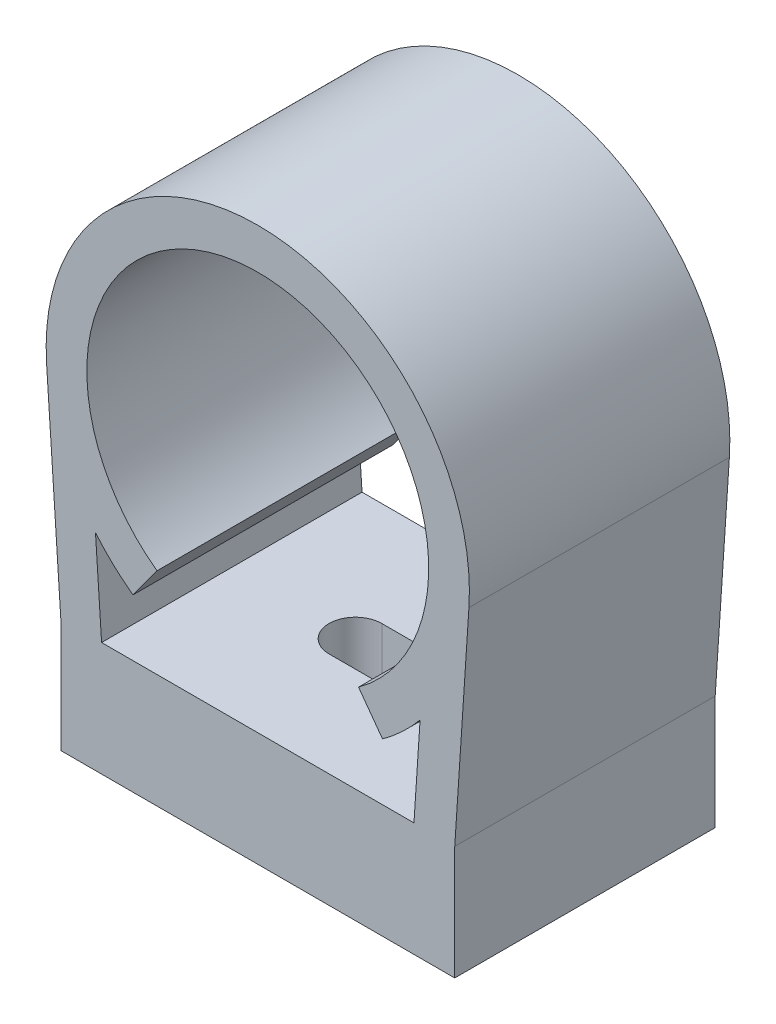
ISO-10303-21;
HEADER;
FILE_DESCRIPTION(('STEP AP214'),'2;1');
FILE_NAME('part.step','',(''),(''),'','','');
FILE_SCHEMA(('AUTOMOTIVE_DESIGN { 1 0 10303 214 1 1 1 1 }'));
ENDSEC;
DATA;
#1=APPLICATION_CONTEXT('core data for automotive mechanical design processes');
#2=APPLICATION_PROTOCOL_DEFINITION('international standard','automotive_design',2000,#1);
#3=PRODUCT_CONTEXT('',#1,'mechanical');
#4=PRODUCT('Part','Part','',(#3));
#5=PRODUCT_RELATED_PRODUCT_CATEGORY('part','',(#4));
#6=PRODUCT_DEFINITION_FORMATION('','',#4);
#7=PRODUCT_DEFINITION_CONTEXT('part definition',#1,'design');
#8=PRODUCT_DEFINITION('design','',#6,#7);
#9=PRODUCT_DEFINITION_SHAPE('','',#8);
#10=(LENGTH_UNIT() NAMED_UNIT(*) SI_UNIT(.MILLI.,.METRE.));
#11=(NAMED_UNIT(*) PLANE_ANGLE_UNIT() SI_UNIT($,.RADIAN.));
#12=(NAMED_UNIT(*) SI_UNIT($,.STERADIAN.) SOLID_ANGLE_UNIT());
#13=UNCERTAINTY_MEASURE_WITH_UNIT(LENGTH_MEASURE(1.E-05),#10,'distance_accuracy_value','');
#14=(GEOMETRIC_REPRESENTATION_CONTEXT(3) GLOBAL_UNCERTAINTY_ASSIGNED_CONTEXT((#13)) GLOBAL_UNIT_ASSIGNED_CONTEXT((#10,
#11,#12)) REPRESENTATION_CONTEXT('',''));
#15=CARTESIAN_POINT('',(0.,0.,0.));
#16=DIRECTION('',(0.,0.,1.));
#17=DIRECTION('',(1.,0.,0.));
#18=AXIS2_PLACEMENT_3D('',#15,#16,#17);
#19=CARTESIAN_POINT('',(15.367,26.67,20.32));
#20=DIRECTION('',(0.,0.,1.));
#21=DIRECTION('',(1.,0.,0.));
#22=AXIS2_PLACEMENT_3D('',#19,#20,#21);
#23=PLANE('',#22);
#24=DIRECTION('',(0.,-1.,0.));
#25=VECTOR('',#24,1.);
#26=CARTESIAN_POINT('',(0.,0.,20.32));
#27=LINE('',#26,#25);
#28=CARTESIAN_POINT('',(0.,8.89,20.32));
#29=VERTEX_POINT('',#28);
#30=CARTESIAN_POINT('',(0.,0.,20.32));
#31=VERTEX_POINT('',#30);
#32=EDGE_CURVE('E256',#29,#31,#27,.T.);
#33=ORIENTED_EDGE('',*,*,#32,.T.);
#34=DIRECTION('',(1.,0.,0.));
#35=VECTOR('',#34,1.);
#36=CARTESIAN_POINT('',(0.,0.,20.32));
#37=LINE('',#36,#35);
#38=CARTESIAN_POINT('',(30.734,0.,20.32));
#39=VERTEX_POINT('',#38);
#40=EDGE_CURVE('E259',#31,#39,#37,.T.);
#41=ORIENTED_EDGE('',*,*,#40,.T.);
#42=DIRECTION('',(0.,1.,0.));
#43=VECTOR('',#42,1.);
#44=CARTESIAN_POINT('',(30.734,0.,20.32));
#45=LINE('',#44,#43);
#46=CARTESIAN_POINT('',(30.734,8.89,20.32));
#47=VERTEX_POINT('',#46);
#48=EDGE_CURVE('E262',#39,#47,#45,.T.);
#49=ORIENTED_EDGE('',*,*,#48,.T.);
#50=DIRECTION('',(0.0661805168711333,0.997807666430094,0.));
#51=VECTOR('',#50,1.);
#52=CARTESIAN_POINT('',(30.734,8.89,20.32));
#53=LINE('',#52,#51);
#54=CARTESIAN_POINT('',(31.8408045727609,25.5773596664576,20.32));
#55=VERTEX_POINT('',#54);
#56=EDGE_CURVE('E264',#47,#55,#53,.T.);
#57=ORIENTED_EDGE('',*,*,#56,.T.);
#58=CARTESIAN_POINT('',(15.367,26.67,20.32));
#59=DIRECTION('',(0.,0.,1.));
#60=DIRECTION('',(1.,0.,0.));
#61=AXIS2_PLACEMENT_3D('',#58,#59,#60);
#62=CIRCLE('',#61,16.51);
#63=CARTESIAN_POINT('',(-1.10680457276085,25.5773596664576,20.32));
#64=VERTEX_POINT('',#63);
#65=EDGE_CURVE('E266',#55,#64,#62,.T.);
#66=ORIENTED_EDGE('',*,*,#65,.T.);
#67=DIRECTION('',(0.0661805168711327,-0.997807666430094,0.));
#68=VECTOR('',#67,1.);
#69=CARTESIAN_POINT('',(0.,8.89,20.32));
#70=LINE('',#69,#68);
#71=EDGE_CURVE('E268',#64,#29,#70,.T.);
#72=ORIENTED_EDGE('',*,*,#71,.T.);
#73=EDGE_LOOP('',(#33,#41,#49,#57,#66,#72));
#74=FACE_BOUND('',#73,.T.);
#75=DIRECTION('',(0.0661805168711333,-0.997807666430094,0.));
#76=VECTOR('',#75,1.);
#77=CARTESIAN_POINT('',(3.18197595269974,8.89,20.32));
#78=LINE('',#77,#76);
#79=CARTESIAN_POINT('',(2.70546011961717,16.0744581140238,20.32));
#80=VERTEX_POINT('',#79);
#81=CARTESIAN_POINT('',(3.18197595269974,8.89,20.32));
#82=VERTEX_POINT('',#81);
#83=EDGE_CURVE('E199',#80,#82,#78,.T.);
#84=ORIENTED_EDGE('',*,*,#83,.F.);
#85=CARTESIAN_POINT('',(15.367,26.67,20.32));
#86=DIRECTION('',(0.,0.,-1.));
#87=DIRECTION('',(1.,0.,0.));
#88=AXIS2_PLACEMENT_3D('',#85,#86,#87);
#89=CIRCLE('',#88,16.51);
#90=CARTESIAN_POINT('',(5.63263432986,13.335,20.32));
#91=VERTEX_POINT('',#90);
#92=EDGE_CURVE('E197',#91,#80,#89,.T.);
#93=ORIENTED_EDGE('',*,*,#92,.F.);
#94=DIRECTION('',(-0.589604219875227,-0.807692307692308,0.));
#95=VECTOR('',#94,1.);
#96=CARTESIAN_POINT('',(5.63263432986,13.335,20.32));
#97=LINE('',#96,#95);
#98=CARTESIAN_POINT('',(7.50462772796385,15.8994230769231,20.32));
#99=VERTEX_POINT('',#98);
#100=EDGE_CURVE('E213',#99,#91,#97,.T.);
#101=ORIENTED_EDGE('',*,*,#100,.F.);
#102=CARTESIAN_POINT('',(15.367,26.67,20.32));
#103=DIRECTION('',(0.,0.,1.));
#104=DIRECTION('',(1.,0.,0.));
#105=AXIS2_PLACEMENT_3D('',#102,#103,#104);
#106=CIRCLE('',#105,13.335);
#107=CARTESIAN_POINT('',(23.2293722720361,15.8994230769231,20.32));
#108=VERTEX_POINT('',#107);
#109=EDGE_CURVE('E210',#108,#99,#106,.T.);
#110=ORIENTED_EDGE('',*,*,#109,.F.);
#111=DIRECTION('',(-0.589604219875227,0.807692307692307,0.));
#112=VECTOR('',#111,1.);
#113=CARTESIAN_POINT('',(25.10136567014,13.335,20.32));
#114=LINE('',#113,#112);
#115=CARTESIAN_POINT('',(25.10136567014,13.335,20.32));
#116=VERTEX_POINT('',#115);
#117=EDGE_CURVE('E208',#116,#108,#114,.T.);
#118=ORIENTED_EDGE('',*,*,#117,.F.);
#119=CARTESIAN_POINT('',(15.367,26.67,20.32));
#120=DIRECTION('',(0.,0.,-1.));
#121=DIRECTION('',(1.,0.,0.));
#122=AXIS2_PLACEMENT_3D('',#119,#120,#121);
#123=CIRCLE('',#122,16.51);
#124=CARTESIAN_POINT('',(28.0285398803828,16.0744581140238,20.32));
#125=VERTEX_POINT('',#124);
#126=EDGE_CURVE('E206',#125,#116,#123,.T.);
#127=ORIENTED_EDGE('',*,*,#126,.F.);
#128=DIRECTION('',(0.066180516871133,0.997807666430094,0.));
#129=VECTOR('',#128,1.);
#130=CARTESIAN_POINT('',(27.5520240473003,8.89,20.32));
#131=LINE('',#130,#129);
#132=CARTESIAN_POINT('',(27.5520240473003,8.89,20.32));
#133=VERTEX_POINT('',#132);
#134=EDGE_CURVE('E204',#133,#125,#131,.T.);
#135=ORIENTED_EDGE('',*,*,#134,.F.);
#136=DIRECTION('',(1.,0.,0.));
#137=VECTOR('',#136,1.);
#138=CARTESIAN_POINT('',(3.18197595269974,8.89,20.32));
#139=LINE('',#138,#137);
#140=EDGE_CURVE('E202',#82,#133,#139,.T.);
#141=ORIENTED_EDGE('',*,*,#140,.F.);
#142=EDGE_LOOP('',(#84,#93,#101,#110,#118,#127,#135,#141));
#143=FACE_BOUND('',#142,.T.);
#144=ADVANCED_FACE('F35',(#74,#143),#23,.T.);
#145=CARTESIAN_POINT('',(15.367,26.67,0.));
#146=DIRECTION('',(0.,0.,1.));
#147=DIRECTION('',(1.,0.,0.));
#148=AXIS2_PLACEMENT_3D('',#145,#146,#147);
#149=PLANE('',#148);
#150=DIRECTION('',(0.,-1.,0.));
#151=VECTOR('',#150,1.);
#152=CARTESIAN_POINT('',(0.,0.,0.));
#153=LINE('',#152,#151);
#154=CARTESIAN_POINT('',(0.,8.89,0.));
#155=VERTEX_POINT('',#154);
#156=CARTESIAN_POINT('',(0.,0.,0.));
#157=VERTEX_POINT('',#156);
#158=EDGE_CURVE('E255',#155,#157,#153,.T.);
#159=ORIENTED_EDGE('',*,*,#158,.F.);
#160=DIRECTION('',(0.0661805168711327,-0.997807666430094,0.));
#161=VECTOR('',#160,1.);
#162=CARTESIAN_POINT('',(0.,8.89,0.));
#163=LINE('',#162,#161);
#164=CARTESIAN_POINT('',(-1.10680457276085,25.5773596664576,0.));
#165=VERTEX_POINT('',#164);
#166=EDGE_CURVE('E260',#165,#155,#163,.T.);
#167=ORIENTED_EDGE('',*,*,#166,.F.);
#168=CARTESIAN_POINT('',(15.367,26.67,0.));
#169=DIRECTION('',(0.,0.,1.));
#170=DIRECTION('',(1.,0.,0.));
#171=AXIS2_PLACEMENT_3D('',#168,#169,#170);
#172=CIRCLE('',#171,16.51);
#173=CARTESIAN_POINT('',(31.8408045727609,25.5773596664576,0.));
#174=VERTEX_POINT('',#173);
#175=EDGE_CURVE('E279',#174,#165,#172,.T.);
#176=ORIENTED_EDGE('',*,*,#175,.F.);
#177=DIRECTION('',(0.0661805168711333,0.997807666430094,0.));
#178=VECTOR('',#177,1.);
#179=CARTESIAN_POINT('',(30.734,8.89,0.));
#180=LINE('',#179,#178);
#181=CARTESIAN_POINT('',(30.734,8.89,0.));
#182=VERTEX_POINT('',#181);
#183=EDGE_CURVE('E277',#182,#174,#180,.T.);
#184=ORIENTED_EDGE('',*,*,#183,.F.);
#185=DIRECTION('',(0.,1.,0.));
#186=VECTOR('',#185,1.);
#187=CARTESIAN_POINT('',(30.734,0.,0.));
#188=LINE('',#187,#186);
#189=CARTESIAN_POINT('',(30.734,0.,0.));
#190=VERTEX_POINT('',#189);
#191=EDGE_CURVE('E275',#190,#182,#188,.T.);
#192=ORIENTED_EDGE('',*,*,#191,.F.);
#193=DIRECTION('',(1.,0.,0.));
#194=VECTOR('',#193,1.);
#195=CARTESIAN_POINT('',(0.,0.,0.));
#196=LINE('',#195,#194);
#197=EDGE_CURVE('E273',#157,#190,#196,.T.);
#198=ORIENTED_EDGE('',*,*,#197,.F.);
#199=EDGE_LOOP('',(#159,#167,#176,#184,#192,#198));
#200=FACE_BOUND('',#199,.T.);
#201=CARTESIAN_POINT('',(15.367,26.67,0.));
#202=DIRECTION('',(0.,0.,-1.));
#203=DIRECTION('',(1.,0.,0.));
#204=AXIS2_PLACEMENT_3D('',#201,#202,#203);
#205=CIRCLE('',#204,16.51);
#206=CARTESIAN_POINT('',(5.63263432986,13.335,0.));
#207=VERTEX_POINT('',#206);
#208=CARTESIAN_POINT('',(2.70546011961717,16.0744581140238,0.));
#209=VERTEX_POINT('',#208);
#210=EDGE_CURVE('E177',#207,#209,#205,.T.);
#211=ORIENTED_EDGE('',*,*,#210,.T.);
#212=DIRECTION('',(0.0661805168711333,-0.997807666430094,0.));
#213=VECTOR('',#212,1.);
#214=CARTESIAN_POINT('',(3.18197595269974,8.89,0.));
#215=LINE('',#214,#213);
#216=CARTESIAN_POINT('',(3.18197595269974,8.89,0.));
#217=VERTEX_POINT('',#216);
#218=EDGE_CURVE('E218',#209,#217,#215,.T.);
#219=ORIENTED_EDGE('',*,*,#218,.T.);
#220=DIRECTION('',(1.,0.,0.));
#221=VECTOR('',#220,1.);
#222=CARTESIAN_POINT('',(3.18197595269974,8.89,0.));
#223=LINE('',#222,#221);
#224=CARTESIAN_POINT('',(27.5520240473003,8.89,0.));
#225=VERTEX_POINT('',#224);
#226=EDGE_CURVE('E221',#217,#225,#223,.T.);
#227=ORIENTED_EDGE('',*,*,#226,.T.);
#228=DIRECTION('',(0.066180516871133,0.997807666430094,0.));
#229=VECTOR('',#228,1.);
#230=CARTESIAN_POINT('',(27.5520240473003,8.89,0.));
#231=LINE('',#230,#229);
#232=CARTESIAN_POINT('',(28.0285398803828,16.0744581140238,0.));
#233=VERTEX_POINT('',#232);
#234=EDGE_CURVE('E224',#225,#233,#231,.T.);
#235=ORIENTED_EDGE('',*,*,#234,.T.);
#236=CARTESIAN_POINT('',(15.367,26.67,0.));
#237=DIRECTION('',(0.,0.,-1.));
#238=DIRECTION('',(1.,0.,0.));
#239=AXIS2_PLACEMENT_3D('',#236,#237,#238);
#240=CIRCLE('',#239,16.51);
#241=CARTESIAN_POINT('',(25.10136567014,13.335,0.));
#242=VERTEX_POINT('',#241);
#243=EDGE_CURVE('E227',#233,#242,#240,.T.);
#244=ORIENTED_EDGE('',*,*,#243,.T.);
#245=DIRECTION('',(-0.589604219875227,0.807692307692307,0.));
#246=VECTOR('',#245,1.);
#247=CARTESIAN_POINT('',(25.10136567014,13.335,0.));
#248=LINE('',#247,#246);
#249=CARTESIAN_POINT('',(23.2293722720361,15.8994230769231,0.));
#250=VERTEX_POINT('',#249);
#251=EDGE_CURVE('E230',#242,#250,#248,.T.);
#252=ORIENTED_EDGE('',*,*,#251,.T.);
#253=CARTESIAN_POINT('',(15.367,26.67,0.));
#254=DIRECTION('',(0.,0.,1.));
#255=DIRECTION('',(1.,0.,0.));
#256=AXIS2_PLACEMENT_3D('',#253,#254,#255);
#257=CIRCLE('',#256,13.335);
#258=CARTESIAN_POINT('',(7.50462772796384,15.8994230769231,0.));
#259=VERTEX_POINT('',#258);
#260=EDGE_CURVE('E233',#250,#259,#257,.T.);
#261=ORIENTED_EDGE('',*,*,#260,.T.);
#262=DIRECTION('',(-0.589604219875227,-0.807692307692308,0.));
#263=VECTOR('',#262,1.);
#264=CARTESIAN_POINT('',(5.63263432986,13.335,0.));
#265=LINE('',#264,#263);
#266=EDGE_CURVE('E200',#259,#207,#265,.T.);
#267=ORIENTED_EDGE('',*,*,#266,.T.);
#268=EDGE_LOOP('',(#211,#219,#227,#235,#244,#252,#261,#267));
#269=FACE_BOUND('',#268,.T.);
#270=ADVANCED_FACE('F302',(#200,#269),#149,.F.);
#271=CARTESIAN_POINT('',(0.,0.,20.32));
#272=DIRECTION('',(1.,0.,0.));
#273=DIRECTION('',(0.,0.,-1.));
#274=AXIS2_PLACEMENT_3D('',#271,#272,#273);
#275=PLANE('',#274);
#276=ORIENTED_EDGE('',*,*,#158,.T.);
#277=DIRECTION('',(0.,0.,-1.));
#278=VECTOR('',#277,1.);
#279=CARTESIAN_POINT('',(0.,0.,20.32));
#280=LINE('',#279,#278);
#281=EDGE_CURVE('E11',#31,#157,#280,.T.);
#282=ORIENTED_EDGE('',*,*,#281,.F.);
#283=ORIENTED_EDGE('',*,*,#32,.F.);
#284=DIRECTION('',(0.,0.,-1.));
#285=VECTOR('',#284,1.);
#286=CARTESIAN_POINT('',(0.,8.89,20.32));
#287=LINE('',#286,#285);
#288=EDGE_CURVE('E270',#29,#155,#287,.T.);
#289=ORIENTED_EDGE('',*,*,#288,.T.);
#290=EDGE_LOOP('',(#276,#282,#283,#289));
#291=FACE_BOUND('',#290,.T.);
#292=ADVANCED_FACE('F37',(#291),#275,.F.);
#293=CARTESIAN_POINT('',(0.,0.,20.32));
#294=DIRECTION('',(0.,1.,0.));
#295=DIRECTION('',(0.,0.,1.));
#296=AXIS2_PLACEMENT_3D('',#293,#294,#295);
#297=PLANE('',#296);
#298=DIRECTION('',(1.,0.,0.));
#299=VECTOR('',#298,1.);
#300=CARTESIAN_POINT('',(12.827,0.,8.1026));
#301=LINE('',#300,#299);
#302=CARTESIAN_POINT('',(12.827,0.,8.1026));
#303=VERTEX_POINT('',#302);
#304=CARTESIAN_POINT('',(17.907,0.,8.1026));
#305=VERTEX_POINT('',#304);
#306=EDGE_CURVE('E183',#303,#305,#301,.T.);
#307=ORIENTED_EDGE('',*,*,#306,.F.);
#308=CARTESIAN_POINT('',(12.827,0.,10.16));
#309=DIRECTION('',(0.,-1.,0.));
#310=DIRECTION('',(0.,0.,-1.));
#311=AXIS2_PLACEMENT_3D('',#308,#309,#310);
#312=CIRCLE('',#311,2.0574);
#313=CARTESIAN_POINT('',(12.827,0.,12.2174));
#314=VERTEX_POINT('',#313);
#315=EDGE_CURVE('E50',#314,#303,#312,.T.);
#316=ORIENTED_EDGE('',*,*,#315,.F.);
#317=DIRECTION('',(-1.,0.,0.));
#318=VECTOR('',#317,1.);
#319=CARTESIAN_POINT('',(12.827,0.,12.2174));
#320=LINE('',#319,#318);
#321=CARTESIAN_POINT('',(17.907,0.,12.2174));
#322=VERTEX_POINT('',#321);
#323=EDGE_CURVE('E170',#322,#314,#320,.T.);
#324=ORIENTED_EDGE('',*,*,#323,.F.);
#325=CARTESIAN_POINT('',(17.907,0.,10.16));
#326=DIRECTION('',(0.,-1.,0.));
#327=DIRECTION('',(0.,0.,-1.));
#328=AXIS2_PLACEMENT_3D('',#325,#326,#327);
#329=CIRCLE('',#328,2.0574);
#330=EDGE_CURVE('E178',#305,#322,#329,.T.);
#331=ORIENTED_EDGE('',*,*,#330,.F.);
#332=EDGE_LOOP('',(#307,#316,#324,#331));
#333=FACE_BOUND('',#332,.T.);
#334=ORIENTED_EDGE('',*,*,#197,.T.);
#335=DIRECTION('',(0.,0.,-1.));
#336=VECTOR('',#335,1.);
#337=CARTESIAN_POINT('',(30.734,0.,20.32));
#338=LINE('',#337,#336);
#339=EDGE_CURVE('E43',#39,#190,#338,.T.);
#340=ORIENTED_EDGE('',*,*,#339,.F.);
#341=ORIENTED_EDGE('',*,*,#40,.F.);
#342=ORIENTED_EDGE('',*,*,#281,.T.);
#343=EDGE_LOOP('',(#334,#340,#341,#342));
#344=FACE_BOUND('',#343,.T.);
#345=ADVANCED_FACE('F181',(#333,#344),#297,.F.);
#346=CARTESIAN_POINT('',(30.734,0.,20.32));
#347=DIRECTION('',(-1.,0.,0.));
#348=DIRECTION('',(0.,0.,1.));
#349=AXIS2_PLACEMENT_3D('',#346,#347,#348);
#350=PLANE('',#349);
#351=ORIENTED_EDGE('',*,*,#191,.T.);
#352=DIRECTION('',(0.,0.,-1.));
#353=VECTOR('',#352,1.);
#354=CARTESIAN_POINT('',(30.734,8.89,20.32));
#355=LINE('',#354,#353);
#356=EDGE_CURVE('E290',#47,#182,#355,.T.);
#357=ORIENTED_EDGE('',*,*,#356,.F.);
#358=ORIENTED_EDGE('',*,*,#48,.F.);
#359=ORIENTED_EDGE('',*,*,#339,.T.);
#360=EDGE_LOOP('',(#351,#357,#358,#359));
#361=FACE_BOUND('',#360,.T.);
#362=ADVANCED_FACE('F297',(#361),#350,.F.);
#363=CARTESIAN_POINT('',(30.734,8.89,20.32));
#364=DIRECTION('',(-0.997807666430094,0.0661805168711333,0.));
#365=DIRECTION('',(-0.0661805168711333,-0.997807666430094,0.));
#366=AXIS2_PLACEMENT_3D('',#363,#364,#365);
#367=PLANE('',#366);
#368=ORIENTED_EDGE('',*,*,#183,.T.);
#369=DIRECTION('',(0.,0.,-1.));
#370=VECTOR('',#369,1.);
#371=CARTESIAN_POINT('',(31.8408045727609,25.5773596664576,20.32));
#372=LINE('',#371,#370);
#373=EDGE_CURVE('E287',#55,#174,#372,.T.);
#374=ORIENTED_EDGE('',*,*,#373,.F.);
#375=ORIENTED_EDGE('',*,*,#56,.F.);
#376=ORIENTED_EDGE('',*,*,#356,.T.);
#377=EDGE_LOOP('',(#368,#374,#375,#376));
#378=FACE_BOUND('',#377,.T.);
#379=ADVANCED_FACE('F308',(#378),#367,.F.);
#380=CARTESIAN_POINT('',(15.367,26.67,20.32));
#381=DIRECTION('',(0.,0.,-1.));
#382=DIRECTION('',(-1.,0.,0.));
#383=AXIS2_PLACEMENT_3D('',#380,#381,#382);
#384=CYLINDRICAL_SURFACE('',#383,16.51);
#385=ORIENTED_EDGE('',*,*,#175,.T.);
#386=DIRECTION('',(0.,0.,-1.));
#387=VECTOR('',#386,1.);
#388=CARTESIAN_POINT('',(-1.10680457276085,25.5773596664576,20.32));
#389=LINE('',#388,#387);
#390=EDGE_CURVE('E284',#64,#165,#389,.T.);
#391=ORIENTED_EDGE('',*,*,#390,.F.);
#392=ORIENTED_EDGE('',*,*,#65,.F.);
#393=ORIENTED_EDGE('',*,*,#373,.T.);
#394=EDGE_LOOP('',(#385,#391,#392,#393));
#395=FACE_BOUND('',#394,.T.);
#396=ADVANCED_FACE('F312',(#395),#384,.T.);
#397=CARTESIAN_POINT('',(0.,8.89,20.32));
#398=DIRECTION('',(0.997807666430094,0.0661805168711327,0.));
#399=DIRECTION('',(-0.0661805168711327,0.997807666430094,0.));
#400=AXIS2_PLACEMENT_3D('',#397,#398,#399);
#401=PLANE('',#400);
#402=ORIENTED_EDGE('',*,*,#166,.T.);
#403=ORIENTED_EDGE('',*,*,#288,.F.);
#404=ORIENTED_EDGE('',*,*,#71,.F.);
#405=ORIENTED_EDGE('',*,*,#390,.T.);
#406=EDGE_LOOP('',(#402,#403,#404,#405));
#407=FACE_BOUND('',#406,.T.);
#408=ADVANCED_FACE('F322',(#407),#401,.F.);
#409=CARTESIAN_POINT('',(15.367,26.67,20.32));
#410=DIRECTION('',(0.,0.,-1.));
#411=DIRECTION('',(-1.,0.,0.));
#412=AXIS2_PLACEMENT_3D('',#409,#410,#411);
#413=CYLINDRICAL_SURFACE('',#412,16.51);
#414=ORIENTED_EDGE('',*,*,#210,.F.);
#415=DIRECTION('',(0.,0.,-1.));
#416=VECTOR('',#415,1.);
#417=CARTESIAN_POINT('',(5.63263432986,13.335,20.32));
#418=LINE('',#417,#416);
#419=EDGE_CURVE('E215',#91,#207,#418,.T.);
#420=ORIENTED_EDGE('',*,*,#419,.F.);
#421=ORIENTED_EDGE('',*,*,#92,.T.);
#422=DIRECTION('',(0.,0.,-1.));
#423=VECTOR('',#422,1.);
#424=CARTESIAN_POINT('',(2.70546011961717,16.0744581140238,20.32));
#425=LINE('',#424,#423);
#426=EDGE_CURVE('E252',#80,#209,#425,.T.);
#427=ORIENTED_EDGE('',*,*,#426,.T.);
#428=EDGE_LOOP('',(#414,#420,#421,#427));
#429=FACE_BOUND('',#428,.T.);
#430=ADVANCED_FACE('F324',(#429),#413,.T.);
#431=CARTESIAN_POINT('',(3.18197595269974,8.89,20.32));
#432=DIRECTION('',(0.997807666430094,0.0661805168711333,0.));
#433=DIRECTION('',(-0.0661805168711333,0.997807666430094,0.));
#434=AXIS2_PLACEMENT_3D('',#431,#432,#433);
#435=PLANE('',#434);
#436=ORIENTED_EDGE('',*,*,#218,.F.);
#437=ORIENTED_EDGE('',*,*,#426,.F.);
#438=ORIENTED_EDGE('',*,*,#83,.T.);
#439=DIRECTION('',(0.,0.,-1.));
#440=VECTOR('',#439,1.);
#441=CARTESIAN_POINT('',(3.18197595269974,8.89,20.32));
#442=LINE('',#441,#440);
#443=EDGE_CURVE('E250',#82,#217,#442,.T.);
#444=ORIENTED_EDGE('',*,*,#443,.T.);
#445=EDGE_LOOP('',(#436,#437,#438,#444));
#446=FACE_BOUND('',#445,.T.);
#447=ADVANCED_FACE('F330',(#446),#435,.T.);
#448=CARTESIAN_POINT('',(3.18197595269974,8.89,20.32));
#449=DIRECTION('',(0.,1.,0.));
#450=DIRECTION('',(0.,0.,1.));
#451=AXIS2_PLACEMENT_3D('',#448,#449,#450);
#452=PLANE('',#451);
#453=CARTESIAN_POINT('',(12.827,8.89,10.16));
#454=DIRECTION('',(0.,1.,0.));
#455=DIRECTION('',(0.,0.,1.));
#456=AXIS2_PLACEMENT_3D('',#453,#454,#455);
#457=CIRCLE('',#456,2.0574);
#458=CARTESIAN_POINT('',(12.827,8.89,12.2174));
#459=VERTEX_POINT('',#458);
#460=CARTESIAN_POINT('',(12.827,8.89,8.1026));
#461=VERTEX_POINT('',#460);
#462=EDGE_CURVE('E163',#459,#461,#457,.F.);
#463=ORIENTED_EDGE('',*,*,#462,.T.);
#464=DIRECTION('',(1.,0.,0.));
#465=VECTOR('',#464,1.);
#466=CARTESIAN_POINT('',(12.827,8.89,8.1026));
#467=LINE('',#466,#465);
#468=CARTESIAN_POINT('',(17.907,8.89,8.1026));
#469=VERTEX_POINT('',#468);
#470=EDGE_CURVE('E186',#461,#469,#467,.T.);
#471=ORIENTED_EDGE('',*,*,#470,.T.);
#472=CARTESIAN_POINT('',(17.907,8.89,10.16));
#473=DIRECTION('',(0.,1.,0.));
#474=DIRECTION('',(0.,0.,1.));
#475=AXIS2_PLACEMENT_3D('',#472,#473,#474);
#476=CIRCLE('',#475,2.0574);
#477=CARTESIAN_POINT('',(17.907,8.89,12.2174));
#478=VERTEX_POINT('',#477);
#479=EDGE_CURVE('E166',#469,#478,#476,.F.);
#480=ORIENTED_EDGE('',*,*,#479,.T.);
#481=DIRECTION('',(-1.,0.,0.));
#482=VECTOR('',#481,1.);
#483=CARTESIAN_POINT('',(12.827,8.89,12.2174));
#484=LINE('',#483,#482);
#485=EDGE_CURVE('E167',#478,#459,#484,.T.);
#486=ORIENTED_EDGE('',*,*,#485,.T.);
#487=EDGE_LOOP('',(#463,#471,#480,#486));
#488=FACE_BOUND('',#487,.T.);
#489=ORIENTED_EDGE('',*,*,#226,.F.);
#490=ORIENTED_EDGE('',*,*,#443,.F.);
#491=ORIENTED_EDGE('',*,*,#140,.T.);
#492=DIRECTION('',(0.,0.,-1.));
#493=VECTOR('',#492,1.);
#494=CARTESIAN_POINT('',(27.5520240473003,8.89,20.32));
#495=LINE('',#494,#493);
#496=EDGE_CURVE('E248',#133,#225,#495,.T.);
#497=ORIENTED_EDGE('',*,*,#496,.T.);
#498=EDGE_LOOP('',(#489,#490,#491,#497));
#499=FACE_BOUND('',#498,.T.);
#500=ADVANCED_FACE('F343',(#488,#499),#452,.T.);
#501=CARTESIAN_POINT('',(27.5520240473003,8.89,20.32));
#502=DIRECTION('',(-0.997807666430094,0.066180516871133,0.));
#503=DIRECTION('',(-0.066180516871133,-0.997807666430094,0.));
#504=AXIS2_PLACEMENT_3D('',#501,#502,#503);
#505=PLANE('',#504);
#506=ORIENTED_EDGE('',*,*,#234,.F.);
#507=ORIENTED_EDGE('',*,*,#496,.F.);
#508=ORIENTED_EDGE('',*,*,#134,.T.);
#509=DIRECTION('',(0.,0.,-1.));
#510=VECTOR('',#509,1.);
#511=CARTESIAN_POINT('',(28.0285398803828,16.0744581140238,20.32));
#512=LINE('',#511,#510);
#513=EDGE_CURVE('E246',#125,#233,#512,.T.);
#514=ORIENTED_EDGE('',*,*,#513,.T.);
#515=EDGE_LOOP('',(#506,#507,#508,#514));
#516=FACE_BOUND('',#515,.T.);
#517=ADVANCED_FACE('F347',(#516),#505,.T.);
#518=CARTESIAN_POINT('',(15.367,26.67,20.32));
#519=DIRECTION('',(0.,0.,-1.));
#520=DIRECTION('',(-1.,0.,0.));
#521=AXIS2_PLACEMENT_3D('',#518,#519,#520);
#522=CYLINDRICAL_SURFACE('',#521,16.51);
#523=ORIENTED_EDGE('',*,*,#243,.F.);
#524=ORIENTED_EDGE('',*,*,#513,.F.);
#525=ORIENTED_EDGE('',*,*,#126,.T.);
#526=DIRECTION('',(0.,0.,-1.));
#527=VECTOR('',#526,1.);
#528=CARTESIAN_POINT('',(25.10136567014,13.335,20.32));
#529=LINE('',#528,#527);
#530=EDGE_CURVE('E244',#116,#242,#529,.T.);
#531=ORIENTED_EDGE('',*,*,#530,.T.);
#532=EDGE_LOOP('',(#523,#524,#525,#531));
#533=FACE_BOUND('',#532,.T.);
#534=ADVANCED_FACE('F351',(#533),#522,.T.);
#535=CARTESIAN_POINT('',(25.10136567014,13.335,20.32));
#536=DIRECTION('',(-0.807692307692308,-0.589604219875227,0.));
#537=DIRECTION('',(0.589604219875227,-0.807692307692308,0.));
#538=AXIS2_PLACEMENT_3D('',#535,#536,#537);
#539=PLANE('',#538);
#540=ORIENTED_EDGE('',*,*,#251,.F.);
#541=ORIENTED_EDGE('',*,*,#530,.F.);
#542=ORIENTED_EDGE('',*,*,#117,.T.);
#543=DIRECTION('',(0.,0.,-1.));
#544=VECTOR('',#543,1.);
#545=CARTESIAN_POINT('',(23.2293722720361,15.8994230769231,20.32));
#546=LINE('',#545,#544);
#547=EDGE_CURVE('E242',#108,#250,#546,.T.);
#548=ORIENTED_EDGE('',*,*,#547,.T.);
#549=EDGE_LOOP('',(#540,#541,#542,#548));
#550=FACE_BOUND('',#549,.T.);
#551=ADVANCED_FACE('F355',(#550),#539,.T.);
#552=CARTESIAN_POINT('',(15.367,26.67,20.32));
#553=DIRECTION('',(0.,0.,-1.));
#554=DIRECTION('',(-1.,0.,0.));
#555=AXIS2_PLACEMENT_3D('',#552,#553,#554);
#556=CYLINDRICAL_SURFACE('',#555,13.335);
#557=ORIENTED_EDGE('',*,*,#260,.F.);
#558=ORIENTED_EDGE('',*,*,#547,.F.);
#559=ORIENTED_EDGE('',*,*,#109,.T.);
#560=DIRECTION('',(0.,0.,-1.));
#561=VECTOR('',#560,1.);
#562=CARTESIAN_POINT('',(7.50462772796384,15.8994230769231,20.32));
#563=LINE('',#562,#561);
#564=EDGE_CURVE('E240',#99,#259,#563,.T.);
#565=ORIENTED_EDGE('',*,*,#564,.T.);
#566=EDGE_LOOP('',(#557,#558,#559,#565));
#567=FACE_BOUND('',#566,.T.);
#568=ADVANCED_FACE('F359',(#567),#556,.F.);
#569=CARTESIAN_POINT('',(5.63263432986,13.335,20.32));
#570=DIRECTION('',(0.807692307692308,-0.589604219875227,0.));
#571=DIRECTION('',(0.589604219875227,0.807692307692308,0.));
#572=AXIS2_PLACEMENT_3D('',#569,#570,#571);
#573=PLANE('',#572);
#574=ORIENTED_EDGE('',*,*,#266,.F.);
#575=ORIENTED_EDGE('',*,*,#564,.F.);
#576=ORIENTED_EDGE('',*,*,#100,.T.);
#577=ORIENTED_EDGE('',*,*,#419,.T.);
#578=EDGE_LOOP('',(#574,#575,#576,#577));
#579=FACE_BOUND('',#578,.T.);
#580=ADVANCED_FACE('F363',(#579),#573,.T.);
#581=CARTESIAN_POINT('',(12.827,43.181,10.16));
#582=DIRECTION('',(0.,-1.,0.));
#583=DIRECTION('',(0.,0.,-1.));
#584=AXIS2_PLACEMENT_3D('',#581,#582,#583);
#585=CYLINDRICAL_SURFACE('',#584,2.0574);
#586=DIRECTION('',(0.,-1.,0.));
#587=VECTOR('',#586,1.);
#588=CARTESIAN_POINT('',(12.827,43.181,12.2174));
#589=LINE('',#588,#587);
#590=EDGE_CURVE('E159',#459,#314,#589,.T.);
#591=ORIENTED_EDGE('',*,*,#590,.T.);
#592=ORIENTED_EDGE('',*,*,#315,.T.);
#593=DIRECTION('',(0.,-1.,0.));
#594=VECTOR('',#593,1.);
#595=CARTESIAN_POINT('',(12.827,43.181,8.1026));
#596=LINE('',#595,#594);
#597=EDGE_CURVE('E191',#461,#303,#596,.T.);
#598=ORIENTED_EDGE('',*,*,#597,.F.);
#599=ORIENTED_EDGE('',*,*,#462,.F.);
#600=EDGE_LOOP('',(#591,#592,#598,#599));
#601=FACE_BOUND('',#600,.T.);
#602=ADVANCED_FACE('F161',(#601),#585,.F.);
#603=CARTESIAN_POINT('',(12.827,43.181,12.2174));
#604=DIRECTION('',(0.,0.,1.));
#605=DIRECTION('',(1.,0.,0.));
#606=AXIS2_PLACEMENT_3D('',#603,#604,#605);
#607=PLANE('',#606);
#608=DIRECTION('',(0.,-1.,0.));
#609=VECTOR('',#608,1.);
#610=CARTESIAN_POINT('',(17.907,43.181,12.2174));
#611=LINE('',#610,#609);
#612=EDGE_CURVE('E173',#478,#322,#611,.T.);
#613=ORIENTED_EDGE('',*,*,#612,.T.);
#614=ORIENTED_EDGE('',*,*,#323,.T.);
#615=ORIENTED_EDGE('',*,*,#590,.F.);
#616=ORIENTED_EDGE('',*,*,#485,.F.);
#617=EDGE_LOOP('',(#613,#614,#615,#616));
#618=FACE_BOUND('',#617,.T.);
#619=ADVANCED_FACE('F171',(#618),#607,.F.);
#620=CARTESIAN_POINT('',(17.907,43.181,10.16));
#621=DIRECTION('',(0.,-1.,0.));
#622=DIRECTION('',(0.,0.,-1.));
#623=AXIS2_PLACEMENT_3D('',#620,#621,#622);
#624=CYLINDRICAL_SURFACE('',#623,2.0574);
#625=DIRECTION('',(0.,-1.,0.));
#626=VECTOR('',#625,1.);
#627=CARTESIAN_POINT('',(17.907,43.181,8.1026));
#628=LINE('',#627,#626);
#629=EDGE_CURVE('E58',#469,#305,#628,.T.);
#630=ORIENTED_EDGE('',*,*,#629,.T.);
#631=ORIENTED_EDGE('',*,*,#330,.T.);
#632=ORIENTED_EDGE('',*,*,#612,.F.);
#633=ORIENTED_EDGE('',*,*,#479,.F.);
#634=EDGE_LOOP('',(#630,#631,#632,#633));
#635=FACE_BOUND('',#634,.T.);
#636=ADVANCED_FACE('F372',(#635),#624,.F.);
#637=CARTESIAN_POINT('',(12.827,43.181,8.1026));
#638=DIRECTION('',(0.,0.,-1.));
#639=DIRECTION('',(-1.,0.,0.));
#640=AXIS2_PLACEMENT_3D('',#637,#638,#639);
#641=PLANE('',#640);
#642=ORIENTED_EDGE('',*,*,#597,.T.);
#643=ORIENTED_EDGE('',*,*,#306,.T.);
#644=ORIENTED_EDGE('',*,*,#629,.F.);
#645=ORIENTED_EDGE('',*,*,#470,.F.);
#646=EDGE_LOOP('',(#642,#643,#644,#645));
#647=FACE_BOUND('',#646,.T.);
#648=ADVANCED_FACE('F375',(#647),#641,.F.);
#649=CLOSED_SHELL('',(#144,#270,#292,#345,#362,#379,#396,#408,#430,#447,#500,#517,#534,#551,
#568,#580,#602,#619,#636,#648));
#650=MANIFOLD_SOLID_BREP('B2',#649);
#651=ADVANCED_BREP_SHAPE_REPRESENTATION('',(#18,#650),#14);
#652=SHAPE_DEFINITION_REPRESENTATION(#9,#651);
ENDSEC;
END-ISO-10303-21;
